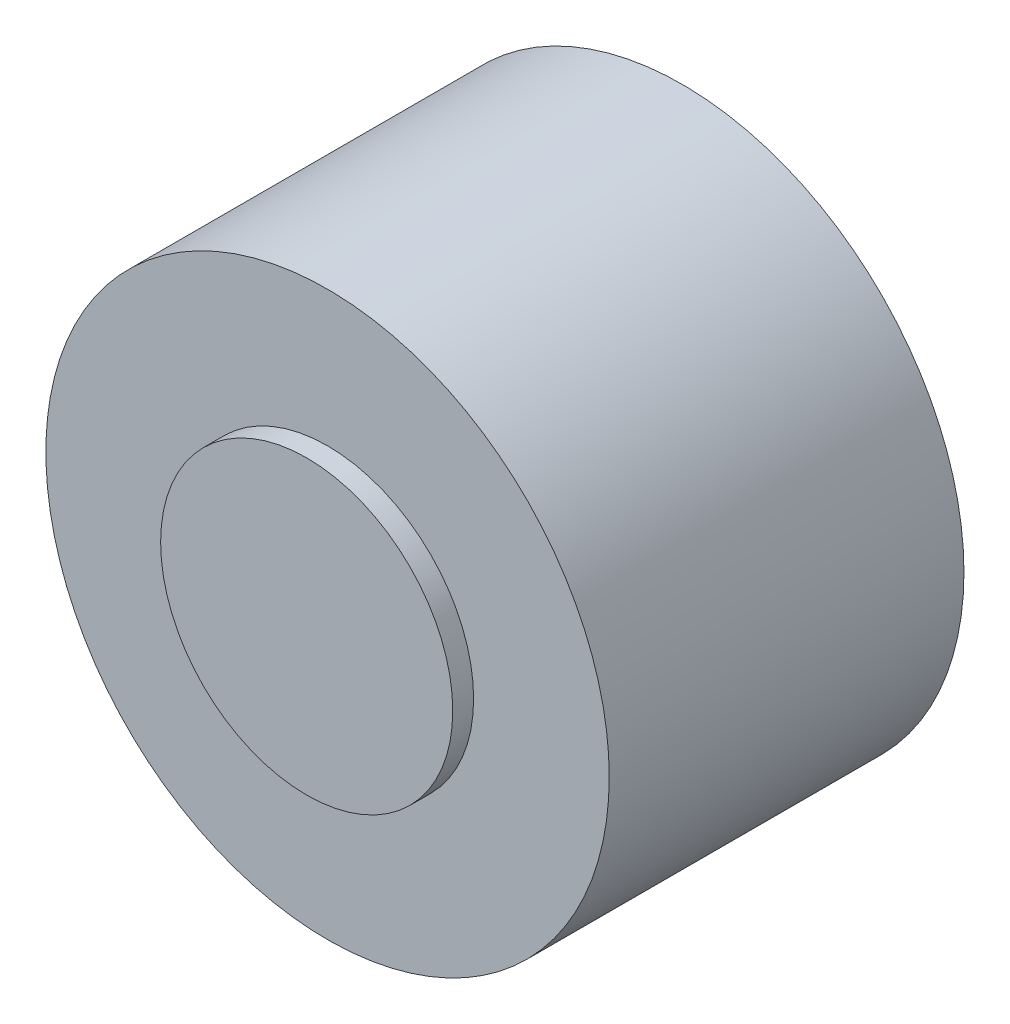
ISO-10303-21;
HEADER;
FILE_DESCRIPTION(('STEP AP214'),'2;1');
FILE_NAME('part.step','',(''),(''),'','','');
FILE_SCHEMA(('AUTOMOTIVE_DESIGN { 1 0 10303 214 1 1 1 1 }'));
ENDSEC;
DATA;
#1=APPLICATION_CONTEXT('core data for automotive mechanical design processes');
#2=APPLICATION_PROTOCOL_DEFINITION('international standard','automotive_design',2000,#1);
#3=PRODUCT_CONTEXT('',#1,'mechanical');
#4=PRODUCT('Part','Part','',(#3));
#5=PRODUCT_RELATED_PRODUCT_CATEGORY('part','',(#4));
#6=PRODUCT_DEFINITION_FORMATION('','',#4);
#7=PRODUCT_DEFINITION_CONTEXT('part definition',#1,'design');
#8=PRODUCT_DEFINITION('design','',#6,#7);
#9=PRODUCT_DEFINITION_SHAPE('','',#8);
#10=(LENGTH_UNIT() NAMED_UNIT(*) SI_UNIT(.MILLI.,.METRE.));
#11=(NAMED_UNIT(*) PLANE_ANGLE_UNIT() SI_UNIT($,.RADIAN.));
#12=(NAMED_UNIT(*) SI_UNIT($,.STERADIAN.) SOLID_ANGLE_UNIT());
#13=UNCERTAINTY_MEASURE_WITH_UNIT(LENGTH_MEASURE(1.E-05),#10,'distance_accuracy_value','');
#14=(GEOMETRIC_REPRESENTATION_CONTEXT(3) GLOBAL_UNCERTAINTY_ASSIGNED_CONTEXT((#13)) GLOBAL_UNIT_ASSIGNED_CONTEXT((#10,
#11,#12)) REPRESENTATION_CONTEXT('',''));
#15=CARTESIAN_POINT('',(0.,0.,0.));
#16=DIRECTION('',(0.,0.,1.));
#17=DIRECTION('',(1.,0.,0.));
#18=AXIS2_PLACEMENT_3D('',#15,#16,#17);
#19=CARTESIAN_POINT('',(0.,0.,17.));
#20=DIRECTION('',(0.,0.,1.));
#21=DIRECTION('',(1.,0.,0.));
#22=AXIS2_PLACEMENT_3D('',#19,#20,#21);
#23=PLANE('',#22);
#24=CARTESIAN_POINT('',(0.,0.,17.));
#25=DIRECTION('',(0.,0.,1.));
#26=DIRECTION('',(1.,0.,0.));
#27=AXIS2_PLACEMENT_3D('',#24,#25,#26);
#28=CIRCLE('',#27,13.5);
#29=CARTESIAN_POINT('',(13.5,0.,17.));
#30=VERTEX_POINT('',#29);
#31=EDGE_CURVE('E10',#30,#30,#28,.T.);
#32=ORIENTED_EDGE('',*,*,#31,.T.);
#33=EDGE_LOOP('',(#32));
#34=FACE_BOUND('',#33,.T.);
#35=CARTESIAN_POINT('',(0.,0.,17.));
#36=DIRECTION('',(0.,0.,1.));
#37=DIRECTION('',(1.,0.,0.));
#38=AXIS2_PLACEMENT_3D('',#35,#36,#37);
#39=CIRCLE('',#38,7.);
#40=CARTESIAN_POINT('',(7.,0.,17.));
#41=VERTEX_POINT('',#40);
#42=EDGE_CURVE('E45',#41,#41,#39,.T.);
#43=ORIENTED_EDGE('',*,*,#42,.F.);
#44=EDGE_LOOP('',(#43));
#45=FACE_BOUND('',#44,.T.);
#46=ADVANCED_FACE('F32',(#34,#45),#23,.T.);
#47=CARTESIAN_POINT('',(0.,0.,17.));
#48=DIRECTION('',(0.,0.,-1.));
#49=DIRECTION('',(-1.,0.,0.));
#50=AXIS2_PLACEMENT_3D('',#47,#48,#49);
#51=CYLINDRICAL_SURFACE('',#50,13.5);
#52=ORIENTED_EDGE('',*,*,#31,.F.);
#53=EDGE_LOOP('',(#52));
#54=FACE_BOUND('',#53,.T.);
#55=CARTESIAN_POINT('',(0.,0.,0.));
#56=DIRECTION('',(0.,0.,1.));
#57=DIRECTION('',(1.,0.,0.));
#58=AXIS2_PLACEMENT_3D('',#55,#56,#57);
#59=CIRCLE('',#58,13.5);
#60=CARTESIAN_POINT('',(13.5,0.,0.));
#61=VERTEX_POINT('',#60);
#62=EDGE_CURVE('E36',#61,#61,#59,.T.);
#63=ORIENTED_EDGE('',*,*,#62,.T.);
#64=EDGE_LOOP('',(#63));
#65=FACE_BOUND('',#64,.T.);
#66=ADVANCED_FACE('F34',(#54,#65),#51,.T.);
#67=CARTESIAN_POINT('',(0.,0.,0.));
#68=DIRECTION('',(0.,0.,1.));
#69=DIRECTION('',(1.,0.,0.));
#70=AXIS2_PLACEMENT_3D('',#67,#68,#69);
#71=PLANE('',#70);
#72=ORIENTED_EDGE('',*,*,#62,.F.);
#73=EDGE_LOOP('',(#72));
#74=FACE_BOUND('',#73,.T.);
#75=ADVANCED_FACE('F56',(#74),#71,.F.);
#76=CARTESIAN_POINT('',(0.,0.,18.));
#77=DIRECTION('',(0.,0.,-1.));
#78=DIRECTION('',(-1.,0.,0.));
#79=AXIS2_PLACEMENT_3D('',#76,#77,#78);
#80=CYLINDRICAL_SURFACE('',#79,7.);
#81=CARTESIAN_POINT('',(0.,0.,18.));
#82=DIRECTION('',(0.,0.,1.));
#83=DIRECTION('',(1.,0.,0.));
#84=AXIS2_PLACEMENT_3D('',#81,#82,#83);
#85=CIRCLE('',#84,7.);
#86=CARTESIAN_POINT('',(7.,0.,18.));
#87=VERTEX_POINT('',#86);
#88=EDGE_CURVE('E43',#87,#87,#85,.T.);
#89=ORIENTED_EDGE('',*,*,#88,.F.);
#90=EDGE_LOOP('',(#89));
#91=FACE_BOUND('',#90,.T.);
#92=ORIENTED_EDGE('',*,*,#42,.T.);
#93=EDGE_LOOP('',(#92));
#94=FACE_BOUND('',#93,.T.);
#95=ADVANCED_FACE('F53',(#91,#94),#80,.T.);
#96=CARTESIAN_POINT('',(0.,0.,18.));
#97=DIRECTION('',(0.,0.,1.));
#98=DIRECTION('',(1.,0.,0.));
#99=AXIS2_PLACEMENT_3D('',#96,#97,#98);
#100=PLANE('',#99);
#101=ORIENTED_EDGE('',*,*,#88,.T.);
#102=EDGE_LOOP('',(#101));
#103=FACE_BOUND('',#102,.T.);
#104=ADVANCED_FACE('F51',(#103),#100,.T.);
#105=CLOSED_SHELL('',(#46,#66,#75,#95,#104));
#106=MANIFOLD_SOLID_BREP('B2',#105);
#107=ADVANCED_BREP_SHAPE_REPRESENTATION('',(#18,#106),#14);
#108=SHAPE_DEFINITION_REPRESENTATION(#9,#107);
ENDSEC;
END-ISO-10303-21;
